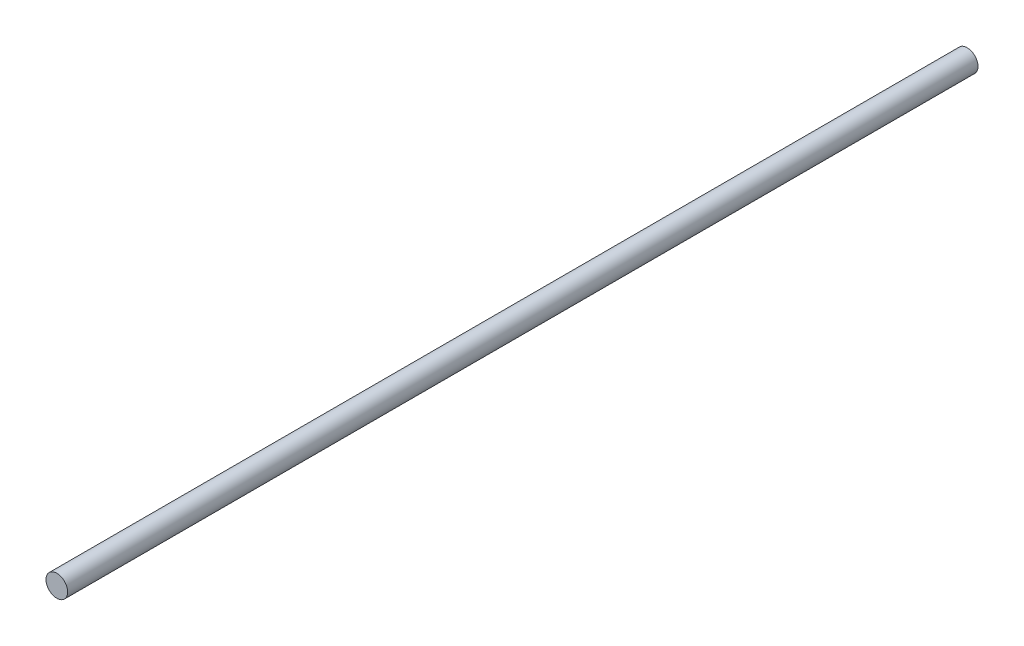
ISO-10303-21;
HEADER;
FILE_DESCRIPTION(('STEP AP214'),'2;1');
FILE_NAME('part.step','',(''),(''),'','','');
FILE_SCHEMA(('AUTOMOTIVE_DESIGN { 1 0 10303 214 1 1 1 1 }'));
ENDSEC;
DATA;
#1=APPLICATION_CONTEXT('core data for automotive mechanical design processes');
#2=APPLICATION_PROTOCOL_DEFINITION('international standard','automotive_design',2000,#1);
#3=PRODUCT_CONTEXT('',#1,'mechanical');
#4=PRODUCT('Part','Part','',(#3));
#5=PRODUCT_RELATED_PRODUCT_CATEGORY('part','',(#4));
#6=PRODUCT_DEFINITION_FORMATION('','',#4);
#7=PRODUCT_DEFINITION_CONTEXT('part definition',#1,'design');
#8=PRODUCT_DEFINITION('design','',#6,#7);
#9=PRODUCT_DEFINITION_SHAPE('','',#8);
#10=(LENGTH_UNIT() NAMED_UNIT(*) SI_UNIT(.MILLI.,.METRE.));
#11=(NAMED_UNIT(*) PLANE_ANGLE_UNIT() SI_UNIT($,.RADIAN.));
#12=(NAMED_UNIT(*) SI_UNIT($,.STERADIAN.) SOLID_ANGLE_UNIT());
#13=UNCERTAINTY_MEASURE_WITH_UNIT(LENGTH_MEASURE(1.E-05),#10,'distance_accuracy_value','');
#14=(GEOMETRIC_REPRESENTATION_CONTEXT(3) GLOBAL_UNCERTAINTY_ASSIGNED_CONTEXT((#13)) GLOBAL_UNIT_ASSIGNED_CONTEXT((#10,
#11,#12)) REPRESENTATION_CONTEXT('',''));
#15=CARTESIAN_POINT('',(0.,0.,0.));
#16=DIRECTION('',(0.,0.,1.));
#17=DIRECTION('',(1.,0.,0.));
#18=AXIS2_PLACEMENT_3D('',#15,#16,#17);
#19=CARTESIAN_POINT('',(0.,0.,335.9));
#20=DIRECTION('',(0.,0.,-1.));
#21=DIRECTION('',(-1.,0.,0.));
#22=AXIS2_PLACEMENT_3D('',#19,#20,#21);
#23=CYLINDRICAL_SURFACE('',#22,4.);
#24=CARTESIAN_POINT('',(0.,0.,335.9));
#25=DIRECTION('',(0.,0.,1.));
#26=DIRECTION('',(1.,0.,0.));
#27=AXIS2_PLACEMENT_3D('',#24,#25,#26);
#28=CIRCLE('',#27,4.);
#29=CARTESIAN_POINT('',(4.,0.,335.9));
#30=VERTEX_POINT('',#29);
#31=EDGE_CURVE('E10',#30,#30,#28,.T.);
#32=ORIENTED_EDGE('',*,*,#31,.F.);
#33=EDGE_LOOP('',(#32));
#34=FACE_BOUND('',#33,.T.);
#35=CARTESIAN_POINT('',(0.,0.,0.));
#36=DIRECTION('',(0.,0.,1.));
#37=DIRECTION('',(1.,0.,0.));
#38=AXIS2_PLACEMENT_3D('',#35,#36,#37);
#39=CIRCLE('',#38,4.);
#40=CARTESIAN_POINT('',(4.,0.,0.));
#41=VERTEX_POINT('',#40);
#42=EDGE_CURVE('E36',#41,#41,#39,.T.);
#43=ORIENTED_EDGE('',*,*,#42,.T.);
#44=EDGE_LOOP('',(#43));
#45=FACE_BOUND('',#44,.T.);
#46=ADVANCED_FACE('F33',(#34,#45),#23,.T.);
#47=CARTESIAN_POINT('',(0.,0.,335.9));
#48=DIRECTION('',(0.,0.,1.));
#49=DIRECTION('',(1.,0.,0.));
#50=AXIS2_PLACEMENT_3D('',#47,#48,#49);
#51=PLANE('',#50);
#52=ORIENTED_EDGE('',*,*,#31,.T.);
#53=EDGE_LOOP('',(#52));
#54=FACE_BOUND('',#53,.T.);
#55=ADVANCED_FACE('F48',(#54),#51,.T.);
#56=CARTESIAN_POINT('',(0.,0.,0.));
#57=DIRECTION('',(0.,0.,1.));
#58=DIRECTION('',(1.,0.,0.));
#59=AXIS2_PLACEMENT_3D('',#56,#57,#58);
#60=PLANE('',#59);
#61=ORIENTED_EDGE('',*,*,#42,.F.);
#62=EDGE_LOOP('',(#61));
#63=FACE_BOUND('',#62,.T.);
#64=ADVANCED_FACE('F46',(#63),#60,.F.);
#65=CLOSED_SHELL('',(#46,#55,#64));
#66=MANIFOLD_SOLID_BREP('B2',#65);
#67=ADVANCED_BREP_SHAPE_REPRESENTATION('',(#18,#66),#14);
#68=SHAPE_DEFINITION_REPRESENTATION(#9,#67);
ENDSEC;
END-ISO-10303-21;
